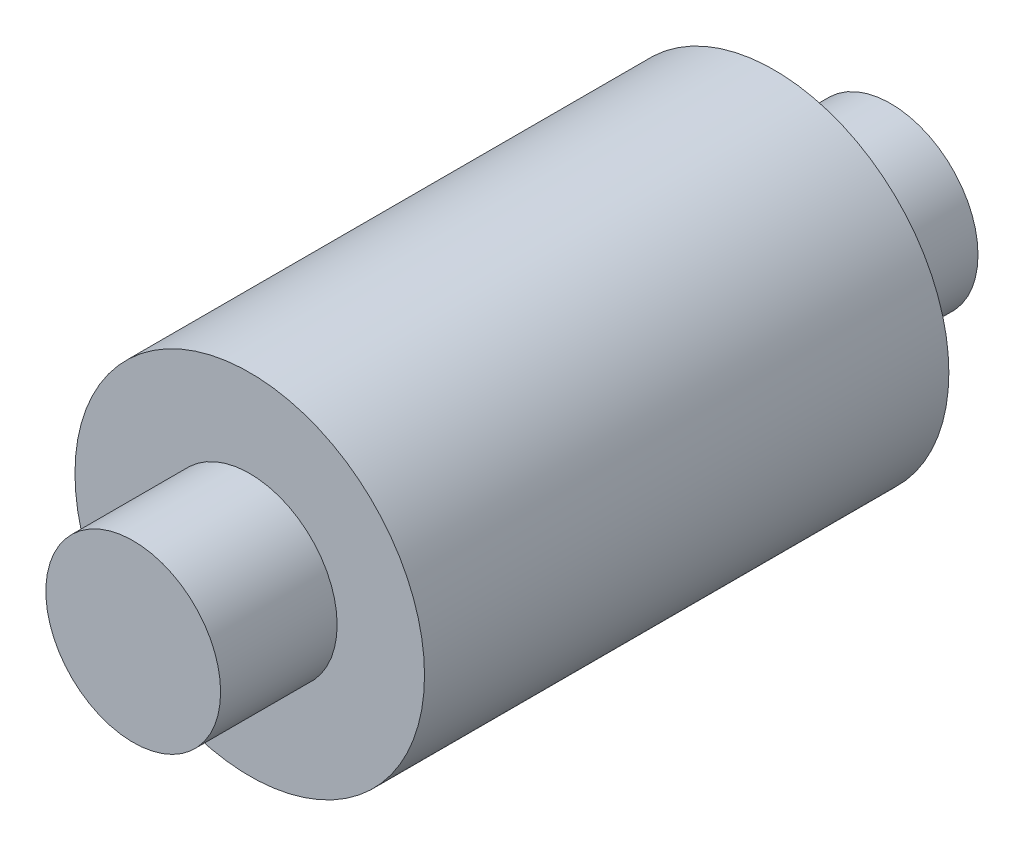
ISO-10303-21;
HEADER;
FILE_DESCRIPTION(('STEP AP214'),'2;1');
FILE_NAME('part.step','',(''),(''),'','','');
FILE_SCHEMA(('AUTOMOTIVE_DESIGN { 1 0 10303 214 1 1 1 1 }'));
ENDSEC;
DATA;
#1=APPLICATION_CONTEXT('core data for automotive mechanical design processes');
#2=APPLICATION_PROTOCOL_DEFINITION('international standard','automotive_design',2000,#1);
#3=PRODUCT_CONTEXT('',#1,'mechanical');
#4=PRODUCT('Part','Part','',(#3));
#5=PRODUCT_RELATED_PRODUCT_CATEGORY('part','',(#4));
#6=PRODUCT_DEFINITION_FORMATION('','',#4);
#7=PRODUCT_DEFINITION_CONTEXT('part definition',#1,'design');
#8=PRODUCT_DEFINITION('design','',#6,#7);
#9=PRODUCT_DEFINITION_SHAPE('','',#8);
#10=(LENGTH_UNIT() NAMED_UNIT(*) SI_UNIT(.MILLI.,.METRE.));
#11=(NAMED_UNIT(*) PLANE_ANGLE_UNIT() SI_UNIT($,.RADIAN.));
#12=(NAMED_UNIT(*) SI_UNIT($,.STERADIAN.) SOLID_ANGLE_UNIT());
#13=UNCERTAINTY_MEASURE_WITH_UNIT(LENGTH_MEASURE(1.E-05),#10,'distance_accuracy_value','');
#14=(GEOMETRIC_REPRESENTATION_CONTEXT(3) GLOBAL_UNCERTAINTY_ASSIGNED_CONTEXT((#13)) GLOBAL_UNIT_ASSIGNED_CONTEXT((#10,
#11,#12)) REPRESENTATION_CONTEXT('',''));
#15=CARTESIAN_POINT('',(0.,0.,0.));
#16=DIRECTION('',(0.,0.,1.));
#17=DIRECTION('',(1.,0.,0.));
#18=AXIS2_PLACEMENT_3D('',#15,#16,#17);
#19=CARTESIAN_POINT('',(0.,0.,0.));
#20=DIRECTION('',(0.,0.,-1.));
#21=DIRECTION('',(-1.,0.,0.));
#22=AXIS2_PLACEMENT_3D('',#19,#20,#21);
#23=PLANE('',#22);
#24=CARTESIAN_POINT('',(0.,0.,0.));
#25=DIRECTION('',(0.,0.,1.));
#26=DIRECTION('',(1.,0.,0.));
#27=AXIS2_PLACEMENT_3D('',#24,#25,#26);
#28=CIRCLE('',#27,0.75);
#29=CARTESIAN_POINT('',(0.75,0.,0.));
#30=VERTEX_POINT('',#29);
#31=EDGE_CURVE('E10',#30,#30,#28,.T.);
#32=ORIENTED_EDGE('',*,*,#31,.T.);
#33=EDGE_LOOP('',(#32));
#34=FACE_BOUND('',#33,.T.);
#35=ADVANCED_FACE('F37',(#34),#23,.F.);
#36=CARTESIAN_POINT('',(0.,0.,0.));
#37=DIRECTION('',(0.,0.,1.));
#38=DIRECTION('',(1.,0.,0.));
#39=AXIS2_PLACEMENT_3D('',#36,#37,#38);
#40=CYLINDRICAL_SURFACE('',#39,0.75);
#41=ORIENTED_EDGE('',*,*,#31,.F.);
#42=EDGE_LOOP('',(#41));
#43=FACE_BOUND('',#42,.T.);
#44=CARTESIAN_POINT('',(0.,0.,-1.));
#45=DIRECTION('',(0.,0.,1.));
#46=DIRECTION('',(1.,0.,0.));
#47=AXIS2_PLACEMENT_3D('',#44,#45,#46);
#48=CIRCLE('',#47,0.75);
#49=CARTESIAN_POINT('',(0.75,0.,-1.));
#50=VERTEX_POINT('',#49);
#51=EDGE_CURVE('E44',#50,#50,#48,.T.);
#52=ORIENTED_EDGE('',*,*,#51,.T.);
#53=EDGE_LOOP('',(#52));
#54=FACE_BOUND('',#53,.T.);
#55=ADVANCED_FACE('F81',(#43,#54),#40,.T.);
#56=CARTESIAN_POINT('',(0.,0.75,-1.));
#57=DIRECTION('',(0.,0.,-1.));
#58=DIRECTION('',(-1.,0.,0.));
#59=AXIS2_PLACEMENT_3D('',#56,#57,#58);
#60=PLANE('',#59);
#61=ORIENTED_EDGE('',*,*,#51,.F.);
#62=EDGE_LOOP('',(#61));
#63=FACE_BOUND('',#62,.T.);
#64=CARTESIAN_POINT('',(0.,0.,-1.));
#65=DIRECTION('',(0.,0.,1.));
#66=DIRECTION('',(1.,0.,0.));
#67=AXIS2_PLACEMENT_3D('',#64,#65,#66);
#68=CIRCLE('',#67,1.5);
#69=CARTESIAN_POINT('',(1.5,0.,-1.));
#70=VERTEX_POINT('',#69);
#71=EDGE_CURVE('E49',#70,#70,#68,.T.);
#72=ORIENTED_EDGE('',*,*,#71,.T.);
#73=EDGE_LOOP('',(#72));
#74=FACE_BOUND('',#73,.T.);
#75=ADVANCED_FACE('F85',(#63,#74),#60,.F.);
#76=CARTESIAN_POINT('',(0.,0.,0.));
#77=DIRECTION('',(0.,0.,1.));
#78=DIRECTION('',(1.,0.,0.));
#79=AXIS2_PLACEMENT_3D('',#76,#77,#78);
#80=CYLINDRICAL_SURFACE('',#79,1.5);
#81=ORIENTED_EDGE('',*,*,#71,.F.);
#82=EDGE_LOOP('',(#81));
#83=FACE_BOUND('',#82,.T.);
#84=CARTESIAN_POINT('',(0.,0.,-5.5));
#85=DIRECTION('',(0.,0.,1.));
#86=DIRECTION('',(1.,0.,0.));
#87=AXIS2_PLACEMENT_3D('',#84,#85,#86);
#88=CIRCLE('',#87,1.5);
#89=CARTESIAN_POINT('',(1.5,0.,-5.5));
#90=VERTEX_POINT('',#89);
#91=EDGE_CURVE('E54',#90,#90,#88,.T.);
#92=ORIENTED_EDGE('',*,*,#91,.T.);
#93=EDGE_LOOP('',(#92));
#94=FACE_BOUND('',#93,.T.);
#95=ADVANCED_FACE('F90',(#83,#94),#80,.T.);
#96=CARTESIAN_POINT('',(0.,1.5,-5.5));
#97=DIRECTION('',(0.,0.,1.));
#98=DIRECTION('',(1.,0.,0.));
#99=AXIS2_PLACEMENT_3D('',#96,#97,#98);
#100=PLANE('',#99);
#101=ORIENTED_EDGE('',*,*,#91,.F.);
#102=EDGE_LOOP('',(#101));
#103=FACE_BOUND('',#102,.T.);
#104=CARTESIAN_POINT('',(0.,0.,-5.5));
#105=DIRECTION('',(0.,0.,1.));
#106=DIRECTION('',(1.,0.,0.));
#107=AXIS2_PLACEMENT_3D('',#104,#105,#106);
#108=CIRCLE('',#107,0.75);
#109=CARTESIAN_POINT('',(0.75,0.,-5.5));
#110=VERTEX_POINT('',#109);
#111=EDGE_CURVE('E60',#110,#110,#108,.T.);
#112=ORIENTED_EDGE('',*,*,#111,.T.);
#113=EDGE_LOOP('',(#112));
#114=FACE_BOUND('',#113,.T.);
#115=ADVANCED_FACE('F77',(#103,#114),#100,.F.);
#116=CARTESIAN_POINT('',(0.,0.,0.));
#117=DIRECTION('',(0.,0.,1.));
#118=DIRECTION('',(1.,0.,0.));
#119=AXIS2_PLACEMENT_3D('',#116,#117,#118);
#120=CYLINDRICAL_SURFACE('',#119,0.75);
#121=ORIENTED_EDGE('',*,*,#111,.F.);
#122=EDGE_LOOP('',(#121));
#123=FACE_BOUND('',#122,.T.);
#124=CARTESIAN_POINT('',(0.,0.,-6.5));
#125=DIRECTION('',(0.,0.,1.));
#126=DIRECTION('',(1.,0.,0.));
#127=AXIS2_PLACEMENT_3D('',#124,#125,#126);
#128=CIRCLE('',#127,0.75);
#129=CARTESIAN_POINT('',(0.75,0.,-6.5));
#130=VERTEX_POINT('',#129);
#131=EDGE_CURVE('E64',#130,#130,#128,.T.);
#132=ORIENTED_EDGE('',*,*,#131,.T.);
#133=EDGE_LOOP('',(#132));
#134=FACE_BOUND('',#133,.T.);
#135=ADVANCED_FACE('F69',(#123,#134),#120,.T.);
#136=CARTESIAN_POINT('',(0.,0.75,-6.5));
#137=DIRECTION('',(0.,0.,1.));
#138=DIRECTION('',(1.,0.,0.));
#139=AXIS2_PLACEMENT_3D('',#136,#137,#138);
#140=PLANE('',#139);
#141=ORIENTED_EDGE('',*,*,#131,.F.);
#142=EDGE_LOOP('',(#141));
#143=FACE_BOUND('',#142,.T.);
#144=ADVANCED_FACE('F71',(#143),#140,.F.);
#145=CLOSED_SHELL('',(#35,#55,#75,#95,#115,#135,#144));
#146=MANIFOLD_SOLID_BREP('B2',#145);
#147=ADVANCED_BREP_SHAPE_REPRESENTATION('',(#18,#146),#14);
#148=SHAPE_DEFINITION_REPRESENTATION(#9,#147);
ENDSEC;
END-ISO-10303-21;
